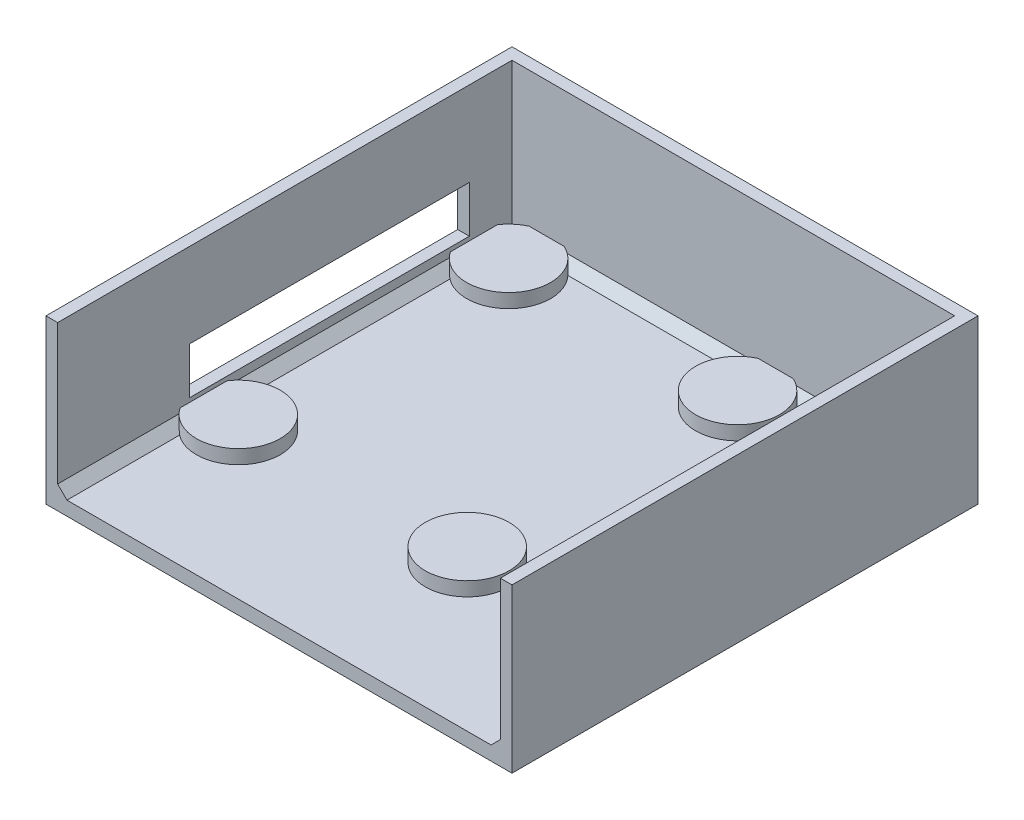
ISO-10303-21;
HEADER;
FILE_DESCRIPTION(('STEP AP214'),'2;1');
FILE_NAME('part.step','',(''),(''),'','','');
FILE_SCHEMA(('AUTOMOTIVE_DESIGN { 1 0 10303 214 1 1 1 1 }'));
ENDSEC;
DATA;
#1=APPLICATION_CONTEXT('core data for automotive mechanical design processes');
#2=APPLICATION_PROTOCOL_DEFINITION('international standard','automotive_design',2000,#1);
#3=PRODUCT_CONTEXT('',#1,'mechanical');
#4=PRODUCT('Part','Part','',(#3));
#5=PRODUCT_RELATED_PRODUCT_CATEGORY('part','',(#4));
#6=PRODUCT_DEFINITION_FORMATION('','',#4);
#7=PRODUCT_DEFINITION_CONTEXT('part definition',#1,'design');
#8=PRODUCT_DEFINITION('design','',#6,#7);
#9=PRODUCT_DEFINITION_SHAPE('','',#8);
#10=(LENGTH_UNIT() NAMED_UNIT(*) SI_UNIT(.MILLI.,.METRE.));
#11=(NAMED_UNIT(*) PLANE_ANGLE_UNIT() SI_UNIT($,.RADIAN.));
#12=(NAMED_UNIT(*) SI_UNIT($,.STERADIAN.) SOLID_ANGLE_UNIT());
#13=UNCERTAINTY_MEASURE_WITH_UNIT(LENGTH_MEASURE(1.E-05),#10,'distance_accuracy_value','');
#14=(GEOMETRIC_REPRESENTATION_CONTEXT(3) GLOBAL_UNCERTAINTY_ASSIGNED_CONTEXT((#13)) GLOBAL_UNIT_ASSIGNED_CONTEXT((#10,
#11,#12)) REPRESENTATION_CONTEXT('',''));
#15=CARTESIAN_POINT('',(0.,0.,0.));
#16=DIRECTION('',(0.,0.,1.));
#17=DIRECTION('',(1.,0.,0.));
#18=AXIS2_PLACEMENT_3D('',#15,#16,#17);
#19=CARTESIAN_POINT('',(-67.4136147725269,35.,-33.8319198921413));
#20=DIRECTION('',(-1.,0.,0.));
#21=DIRECTION('',(0.,0.,1.));
#22=AXIS2_PLACEMENT_3D('',#19,#20,#21);
#23=PLANE('',#22);
#24=DIRECTION('',(0.,0.,1.));
#25=VECTOR('',#24,1.);
#26=CARTESIAN_POINT('',(-67.4136147725269,16.8739403142127,-24.6733703534207));
#27=LINE('',#26,#25);
#28=CARTESIAN_POINT('',(-67.4136147725269,16.8739403142127,-24.6733703534207));
#29=VERTEX_POINT('',#28);
#30=CARTESIAN_POINT('',(-67.4136147725269,16.8739403142127,35.3266296465793));
#31=VERTEX_POINT('',#30);
#32=EDGE_CURVE('E575',#29,#31,#27,.T.);
#33=ORIENTED_EDGE('',*,*,#32,.F.);
#34=DIRECTION('',(0.,1.,0.));
#35=VECTOR('',#34,1.);
#36=CARTESIAN_POINT('',(-67.4136147725269,16.8739403142127,-24.6733703534207));
#37=LINE('',#36,#35);
#38=CARTESIAN_POINT('',(-67.4136147725269,6.87394031421267,-24.6733703534207));
#39=VERTEX_POINT('',#38);
#40=EDGE_CURVE('E252',#39,#29,#37,.T.);
#41=ORIENTED_EDGE('',*,*,#40,.F.);
#42=DIRECTION('',(0.,0.,-1.));
#43=VECTOR('',#42,1.);
#44=CARTESIAN_POINT('',(-67.4136147725269,6.87394031421267,-24.6733703534207));
#45=LINE('',#44,#43);
#46=CARTESIAN_POINT('',(-67.4136147725268,6.87394031421267,35.3266296465794));
#47=VERTEX_POINT('',#46);
#48=EDGE_CURVE('E248',#47,#39,#45,.T.);
#49=ORIENTED_EDGE('',*,*,#48,.F.);
#50=DIRECTION('',(0.,-1.,0.));
#51=VECTOR('',#50,1.);
#52=CARTESIAN_POINT('',(-67.4136147725269,16.8739403142127,35.3266296465793));
#53=LINE('',#52,#51);
#54=EDGE_CURVE('E214',#31,#47,#53,.T.);
#55=ORIENTED_EDGE('',*,*,#54,.F.);
#56=EDGE_LOOP('',(#33,#41,#49,#55));
#57=FACE_BOUND('',#56,.T.);
#58=DIRECTION('',(0.,-1.,0.));
#59=VECTOR('',#58,1.);
#60=CARTESIAN_POINT('',(-67.4136147725268,35.,63.6680801078587));
#61=LINE('',#60,#59);
#62=CARTESIAN_POINT('',(-67.4136147725268,35.,63.6680801078587));
#63=VERTEX_POINT('',#62);
#64=CARTESIAN_POINT('',(-67.4136147725268,5.,63.6680801078587));
#65=VERTEX_POINT('',#64);
#66=EDGE_CURVE('E344',#63,#65,#61,.T.);
#67=ORIENTED_EDGE('',*,*,#66,.T.);
#68=DIRECTION('',(0.,0.,-1.));
#69=VECTOR('',#68,1.);
#70=CARTESIAN_POINT('',(-67.4136147725269,5.,-33.8319198921413));
#71=LINE('',#70,#69);
#72=CARTESIAN_POINT('',(-67.4136147725268,5.,37.3965259119556));
#73=VERTEX_POINT('',#72);
#74=EDGE_CURVE('E416',#65,#73,#71,.T.);
#75=ORIENTED_EDGE('',*,*,#74,.T.);
#76=DIRECTION('',(0.,-1.,0.));
#77=VECTOR('',#76,1.);
#78=CARTESIAN_POINT('',(-67.4136147725268,6.,37.3965259119556));
#79=LINE('',#78,#77);
#80=CARTESIAN_POINT('',(-67.4136147725268,6.,37.3965259119556));
#81=VERTEX_POINT('',#80);
#82=EDGE_CURVE('E264',#81,#73,#79,.T.);
#83=ORIENTED_EDGE('',*,*,#82,.F.);
#84=DIRECTION('',(0.,0.,-1.));
#85=VECTOR('',#84,1.);
#86=CARTESIAN_POINT('',(-67.4136147725269,6.,-33.8319198921413));
#87=LINE('',#86,#85);
#88=CARTESIAN_POINT('',(-67.4136147725268,6.,27.3005324586783));
#89=VERTEX_POINT('',#88);
#90=EDGE_CURVE('E408',#81,#89,#87,.T.);
#91=ORIENTED_EDGE('',*,*,#90,.T.);
#92=DIRECTION('',(0.,-1.,0.));
#93=VECTOR('',#92,1.);
#94=CARTESIAN_POINT('',(-67.4136147725268,6.,27.3005324586783));
#95=LINE('',#94,#93);
#96=CARTESIAN_POINT('',(-67.4136147725268,5.,27.3005324586783));
#97=VERTEX_POINT('',#96);
#98=EDGE_CURVE('E268',#97,#89,#95,.F.);
#99=ORIENTED_EDGE('',*,*,#98,.F.);
#100=DIRECTION('',(0.,0.,-1.));
#101=VECTOR('',#100,1.);
#102=CARTESIAN_POINT('',(-67.4136147725269,5.,-33.8319198921413));
#103=LINE('',#102,#101);
#104=CARTESIAN_POINT('',(-67.4136147725269,5.,-20.609941337993));
#105=VERTEX_POINT('',#104);
#106=EDGE_CURVE('E412',#97,#105,#103,.T.);
#107=ORIENTED_EDGE('',*,*,#106,.T.);
#108=DIRECTION('',(0.,-1.,0.));
#109=VECTOR('',#108,1.);
#110=CARTESIAN_POINT('',(-67.4136147725269,6.,-20.609941337993));
#111=LINE('',#110,#109);
#112=CARTESIAN_POINT('',(-67.4136147725269,6.,-20.609941337993));
#113=VERTEX_POINT('',#112);
#114=EDGE_CURVE('E396',#113,#105,#111,.T.);
#115=ORIENTED_EDGE('',*,*,#114,.F.);
#116=DIRECTION('',(0.,0.,-1.));
#117=VECTOR('',#116,1.);
#118=CARTESIAN_POINT('',(-67.4136147725269,6.,-33.8319198921413));
#119=LINE('',#118,#117);
#120=CARTESIAN_POINT('',(-67.4136147725269,6.,-30.7059347912702));
#121=VERTEX_POINT('',#120);
#122=EDGE_CURVE('E392',#113,#121,#119,.T.);
#123=ORIENTED_EDGE('',*,*,#122,.T.);
#124=DIRECTION('',(0.,-1.,0.));
#125=VECTOR('',#124,1.);
#126=CARTESIAN_POINT('',(-67.4136147725269,6.,-30.7059347912702));
#127=LINE('',#126,#125);
#128=CARTESIAN_POINT('',(-67.4136147725269,3.,-30.7059347912702));
#129=VERTEX_POINT('',#128);
#130=EDGE_CURVE('E400',#129,#121,#127,.F.);
#131=ORIENTED_EDGE('',*,*,#130,.F.);
#132=DIRECTION('',(0.,0.,-1.));
#133=VECTOR('',#132,1.);
#134=CARTESIAN_POINT('',(-67.4136147725269,3.,-33.8319198921413));
#135=LINE('',#134,#133);
#136=CARTESIAN_POINT('',(-67.4136147725269,3.,-33.8319198921413));
#137=VERTEX_POINT('',#136);
#138=EDGE_CURVE('E296',#129,#137,#135,.T.);
#139=ORIENTED_EDGE('',*,*,#138,.T.);
#140=DIRECTION('',(0.,-1.,0.));
#141=VECTOR('',#140,1.);
#142=CARTESIAN_POINT('',(-67.4136147725269,35.,-33.8319198921413));
#143=LINE('',#142,#141);
#144=CARTESIAN_POINT('',(-67.4136147725269,35.,-33.8319198921413));
#145=VERTEX_POINT('',#144);
#146=EDGE_CURVE('E340',#145,#137,#143,.T.);
#147=ORIENTED_EDGE('',*,*,#146,.F.);
#148=DIRECTION('',(0.,0.,-1.));
#149=VECTOR('',#148,1.);
#150=CARTESIAN_POINT('',(-67.4136147725268,35.,61.0418253424466));
#151=LINE('',#150,#149);
#152=EDGE_CURVE('E308',#63,#145,#151,.T.);
#153=ORIENTED_EDGE('',*,*,#152,.F.);
#154=EDGE_LOOP('',(#67,#75,#83,#91,#99,#107,#115,#123,#131,#139,#147,#153));
#155=FACE_BOUND('',#154,.T.);
#156=ADVANCED_FACE('F39',(#57,#155),#23,.F.);
#157=CARTESIAN_POINT('',(-67.4136147725269,35.,-33.8319198921413));
#158=DIRECTION('',(0.,0.,-1.));
#159=DIRECTION('',(-1.,0.,0.));
#160=AXIS2_PLACEMENT_3D('',#157,#158,#159);
#161=PLANE('',#160);
#162=DIRECTION('',(0.,-1.,0.));
#163=VECTOR('',#162,1.);
#164=CARTESIAN_POINT('',(-7.07288139532457,6.,-33.8319198921413));
#165=LINE('',#164,#163);
#166=CARTESIAN_POINT('',(-7.07288139532457,5.,-33.8319198921413));
#167=VERTEX_POINT('',#166);
#168=CARTESIAN_POINT('',(-7.07288139532457,6.,-33.8319198921413));
#169=VERTEX_POINT('',#168);
#170=EDGE_CURVE('E389',#167,#169,#165,.F.);
#171=ORIENTED_EDGE('',*,*,#170,.F.);
#172=DIRECTION('',(1.,0.,0.));
#173=VECTOR('',#172,1.);
#174=CARTESIAN_POINT('',(-67.4136147725269,5.,-33.8319198921413));
#175=LINE('',#174,#173);
#176=CARTESIAN_POINT('',(27.5863852274731,5.,-33.8319198921413));
#177=VERTEX_POINT('',#176);
#178=EDGE_CURVE('E445',#167,#177,#175,.T.);
#179=ORIENTED_EDGE('',*,*,#178,.T.);
#180=DIRECTION('',(0.,-1.,0.));
#181=VECTOR('',#180,1.);
#182=CARTESIAN_POINT('',(27.5863852274731,35.,-33.8319198921413));
#183=LINE('',#182,#181);
#184=CARTESIAN_POINT('',(27.5863852274731,35.,-33.8319198921413));
#185=VERTEX_POINT('',#184);
#186=EDGE_CURVE('E337',#185,#177,#183,.T.);
#187=ORIENTED_EDGE('',*,*,#186,.F.);
#188=DIRECTION('',(1.,0.,0.));
#189=VECTOR('',#188,1.);
#190=CARTESIAN_POINT('',(-67.4136147725269,35.,-33.8319198921413));
#191=LINE('',#190,#189);
#192=EDGE_CURVE('E311',#145,#185,#191,.T.);
#193=ORIENTED_EDGE('',*,*,#192,.F.);
#194=ORIENTED_EDGE('',*,*,#146,.T.);
#195=DIRECTION('',(1.,0.,0.));
#196=VECTOR('',#195,1.);
#197=CARTESIAN_POINT('',(-67.4136147725269,3.,-33.8319198921413));
#198=LINE('',#197,#196);
#199=CARTESIAN_POINT('',(-63.7290262288278,3.,-33.8319198921413));
#200=VERTEX_POINT('',#199);
#201=EDGE_CURVE('E305',#137,#200,#198,.T.);
#202=ORIENTED_EDGE('',*,*,#201,.T.);
#203=DIRECTION('',(0.,-1.,0.));
#204=VECTOR('',#203,1.);
#205=CARTESIAN_POINT('',(-63.7290262288278,6.,-33.8319198921413));
#206=LINE('',#205,#204);
#207=CARTESIAN_POINT('',(-63.7290262288278,6.,-33.8319198921413));
#208=VERTEX_POINT('',#207);
#209=EDGE_CURVE('E285',#208,#200,#206,.T.);
#210=ORIENTED_EDGE('',*,*,#209,.F.);
#211=DIRECTION('',(1.,0.,0.));
#212=VECTOR('',#211,1.);
#213=CARTESIAN_POINT('',(-67.4136147725269,6.,-33.8319198921413));
#214=LINE('',#213,#212);
#215=CARTESIAN_POINT('',(-56.1961592889328,6.,-33.8319198921413));
#216=VERTEX_POINT('',#215);
#217=EDGE_CURVE('E281',#208,#216,#214,.T.);
#218=ORIENTED_EDGE('',*,*,#217,.T.);
#219=DIRECTION('',(0.,-1.,0.));
#220=VECTOR('',#219,1.);
#221=CARTESIAN_POINT('',(-56.1961592889328,6.,-33.8319198921413));
#222=LINE('',#221,#220);
#223=CARTESIAN_POINT('',(-56.1961592889328,5.,-33.8319198921413));
#224=VERTEX_POINT('',#223);
#225=EDGE_CURVE('E288',#224,#216,#222,.F.);
#226=ORIENTED_EDGE('',*,*,#225,.F.);
#227=DIRECTION('',(1.,0.,0.));
#228=VECTOR('',#227,1.);
#229=CARTESIAN_POINT('',(-67.4136147725269,5.,-33.8319198921413));
#230=LINE('',#229,#228);
#231=CARTESIAN_POINT('',(-14.6057483352195,5.,-33.8319198921413));
#232=VERTEX_POINT('',#231);
#233=EDGE_CURVE('E441',#224,#232,#230,.T.);
#234=ORIENTED_EDGE('',*,*,#233,.T.);
#235=DIRECTION('',(0.,-1.,0.));
#236=VECTOR('',#235,1.);
#237=CARTESIAN_POINT('',(-14.6057483352195,6.,-33.8319198921413));
#238=LINE('',#237,#236);
#239=CARTESIAN_POINT('',(-14.6057483352195,6.,-33.8319198921413));
#240=VERTEX_POINT('',#239);
#241=EDGE_CURVE('E385',#240,#232,#238,.T.);
#242=ORIENTED_EDGE('',*,*,#241,.F.);
#243=DIRECTION('',(1.,0.,0.));
#244=VECTOR('',#243,1.);
#245=CARTESIAN_POINT('',(-67.4136147725269,6.,-33.8319198921413));
#246=LINE('',#245,#244);
#247=EDGE_CURVE('E381',#240,#169,#246,.T.);
#248=ORIENTED_EDGE('',*,*,#247,.T.);
#249=EDGE_LOOP('',(#171,#179,#187,#193,#194,#202,#210,#218,#226,#234,#242,#248));
#250=FACE_BOUND('',#249,.T.);
#251=ADVANCED_FACE('F509',(#250),#161,.F.);
#252=CARTESIAN_POINT('',(0.,3.,0.));
#253=DIRECTION('',(0.,1.,0.));
#254=DIRECTION('',(0.,0.,1.));
#255=AXIS2_PLACEMENT_3D('',#252,#253,#254);
#256=PLANE('',#255);
#257=ORIENTED_EDGE('',*,*,#138,.F.);
#258=CARTESIAN_POINT('',(-59.9625927588803,3.,-25.6579380646316));
#259=DIRECTION('',(0.,1.,0.));
#260=DIRECTION('',(0.,0.,1.));
#261=AXIS2_PLACEMENT_3D('',#258,#259,#260);
#262=CIRCLE('',#261,9.);
#263=EDGE_CURVE('E277',#200,#129,#262,.T.);
#264=ORIENTED_EDGE('',*,*,#263,.F.);
#265=ORIENTED_EDGE('',*,*,#201,.F.);
#266=EDGE_LOOP('',(#257,#264,#265));
#267=FACE_BOUND('',#266,.T.);
#268=ADVANCED_FACE('F516',(#267),#256,.T.);
#269=CARTESIAN_POINT('',(-69.9136147725269,3.,-36.3319198921413));
#270=DIRECTION('',(1.,0.,0.));
#271=DIRECTION('',(0.,0.,-1.));
#272=AXIS2_PLACEMENT_3D('',#269,#270,#271);
#273=PLANE('',#272);
#274=DIRECTION('',(0.,0.,1.));
#275=VECTOR('',#274,1.);
#276=CARTESIAN_POINT('',(-69.9136147725268,6.87394031421267,-24.6733703534207));
#277=LINE('',#276,#275);
#278=CARTESIAN_POINT('',(-69.9136147725269,6.87394031421267,-24.6733703534207));
#279=VERTEX_POINT('',#278);
#280=CARTESIAN_POINT('',(-69.9136147725268,6.87394031421267,35.3266296465793));
#281=VERTEX_POINT('',#280);
#282=EDGE_CURVE('E223',#279,#281,#277,.T.);
#283=ORIENTED_EDGE('',*,*,#282,.F.);
#284=DIRECTION('',(0.,-1.,0.));
#285=VECTOR('',#284,1.);
#286=CARTESIAN_POINT('',(-69.9136147725268,16.8739403142127,-24.6733703534207));
#287=LINE('',#286,#285);
#288=CARTESIAN_POINT('',(-69.9136147725268,16.8739403142127,-24.6733703534207));
#289=VERTEX_POINT('',#288);
#290=EDGE_CURVE('E229',#289,#279,#287,.T.);
#291=ORIENTED_EDGE('',*,*,#290,.F.);
#292=DIRECTION('',(0.,0.,-1.));
#293=VECTOR('',#292,1.);
#294=CARTESIAN_POINT('',(-69.9136147725268,16.8739403142127,-24.6733703534207));
#295=LINE('',#294,#293);
#296=CARTESIAN_POINT('',(-69.9136147725268,16.8739403142127,35.3266296465793));
#297=VERTEX_POINT('',#296);
#298=EDGE_CURVE('E234',#297,#289,#295,.T.);
#299=ORIENTED_EDGE('',*,*,#298,.F.);
#300=DIRECTION('',(0.,1.,0.));
#301=VECTOR('',#300,1.);
#302=CARTESIAN_POINT('',(-69.9136147725268,16.8739403142127,35.3266296465793));
#303=LINE('',#302,#301);
#304=EDGE_CURVE('E211',#281,#297,#303,.T.);
#305=ORIENTED_EDGE('',*,*,#304,.F.);
#306=EDGE_LOOP('',(#283,#291,#299,#305));
#307=FACE_BOUND('',#306,.T.);
#308=DIRECTION('',(0.,0.,1.));
#309=VECTOR('',#308,1.);
#310=CARTESIAN_POINT('',(-69.9136147725269,0.,-36.3319198921413));
#311=LINE('',#310,#309);
#312=CARTESIAN_POINT('',(-69.9136147725269,0.,-36.3319198921413));
#313=VERTEX_POINT('',#312);
#314=CARTESIAN_POINT('',(-69.9136147725268,0.,63.6680801078587));
#315=VERTEX_POINT('',#314);
#316=EDGE_CURVE('E348',#313,#315,#311,.T.);
#317=ORIENTED_EDGE('',*,*,#316,.T.);
#318=DIRECTION('',(0.,-1.,0.));
#319=VECTOR('',#318,1.);
#320=CARTESIAN_POINT('',(-69.9136147725268,3.,63.6680801078587));
#321=LINE('',#320,#319);
#322=CARTESIAN_POINT('',(-69.9136147725269,35.,63.6680801078587));
#323=VERTEX_POINT('',#322);
#324=EDGE_CURVE('E377',#323,#315,#321,.T.);
#325=ORIENTED_EDGE('',*,*,#324,.F.);
#326=DIRECTION('',(0.,0.,1.));
#327=VECTOR('',#326,1.);
#328=CARTESIAN_POINT('',(-69.9136147725269,35.,-36.3319198921413));
#329=LINE('',#328,#327);
#330=CARTESIAN_POINT('',(-69.9136147725269,35.,-36.3319198921413));
#331=VERTEX_POINT('',#330);
#332=EDGE_CURVE('E300',#331,#323,#329,.T.);
#333=ORIENTED_EDGE('',*,*,#332,.F.);
#334=DIRECTION('',(0.,-1.,0.));
#335=VECTOR('',#334,1.);
#336=CARTESIAN_POINT('',(-69.9136147725269,3.,-36.3319198921413));
#337=LINE('',#336,#335);
#338=EDGE_CURVE('E353',#331,#313,#337,.T.);
#339=ORIENTED_EDGE('',*,*,#338,.T.);
#340=EDGE_LOOP('',(#317,#325,#333,#339));
#341=FACE_BOUND('',#340,.T.);
#342=ADVANCED_FACE('F231',(#307,#341),#273,.F.);
#343=CARTESIAN_POINT('',(-69.9136147725268,3.,63.6680801078587));
#344=DIRECTION('',(0.,0.,-1.));
#345=DIRECTION('',(-1.,0.,0.));
#346=AXIS2_PLACEMENT_3D('',#343,#344,#345);
#347=PLANE('',#346);
#348=DIRECTION('',(1.,0.,0.));
#349=VECTOR('',#348,1.);
#350=CARTESIAN_POINT('',(-69.9136147725268,0.,63.6680801078587));
#351=LINE('',#350,#349);
#352=CARTESIAN_POINT('',(30.0863852274732,0.,63.6680801078587));
#353=VERTEX_POINT('',#352);
#354=EDGE_CURVE('E358',#315,#353,#351,.T.);
#355=ORIENTED_EDGE('',*,*,#354,.T.);
#356=DIRECTION('',(0.,-1.,0.));
#357=VECTOR('',#356,1.);
#358=CARTESIAN_POINT('',(30.0863852274732,3.,63.6680801078587));
#359=LINE('',#358,#357);
#360=CARTESIAN_POINT('',(30.0863852274732,35.,63.6680801078587));
#361=VERTEX_POINT('',#360);
#362=EDGE_CURVE('E373',#361,#353,#359,.T.);
#363=ORIENTED_EDGE('',*,*,#362,.F.);
#364=DIRECTION('',(1.,0.,0.));
#365=VECTOR('',#364,1.);
#366=CARTESIAN_POINT('',(27.5863852274732,35.,63.6680801078587));
#367=LINE('',#366,#365);
#368=CARTESIAN_POINT('',(27.5863852274732,35.,63.6680801078587));
#369=VERTEX_POINT('',#368);
#370=EDGE_CURVE('E317',#369,#361,#367,.T.);
#371=ORIENTED_EDGE('',*,*,#370,.F.);
#372=DIRECTION('',(0.,-1.,0.));
#373=VECTOR('',#372,1.);
#374=CARTESIAN_POINT('',(27.5863852274732,35.,63.6680801078587));
#375=LINE('',#374,#373);
#376=CARTESIAN_POINT('',(27.5863852274732,5.,63.6680801078587));
#377=VERTEX_POINT('',#376);
#378=EDGE_CURVE('E329',#369,#377,#375,.T.);
#379=ORIENTED_EDGE('',*,*,#378,.T.);
#380=DIRECTION('',(-0.707106781186545,-0.70710678118655,0.));
#381=VECTOR('',#380,1.);
#382=CARTESIAN_POINT('',(-22.1636147725265,-44.75,63.6680801078587));
#383=LINE('',#382,#381);
#384=CARTESIAN_POINT('',(25.5863852274731,3.,63.6680801078587));
#385=VERTEX_POINT('',#384);
#386=EDGE_CURVE('E11',#377,#385,#383,.T.);
#387=ORIENTED_EDGE('',*,*,#386,.T.);
#388=DIRECTION('',(1.,0.,0.));
#389=VECTOR('',#388,1.);
#390=CARTESIAN_POINT('',(-69.9136147725268,3.,63.6680801078587));
#391=LINE('',#390,#389);
#392=CARTESIAN_POINT('',(-65.4136147725269,3.,63.6680801078587));
#393=VERTEX_POINT('',#392);
#394=EDGE_CURVE('E349',#393,#385,#391,.T.);
#395=ORIENTED_EDGE('',*,*,#394,.F.);
#396=DIRECTION('',(-0.707106781186544,0.707106781186551,0.));
#397=VECTOR('',#396,1.);
#398=CARTESIAN_POINT('',(-67.6636147725268,5.24999999999999,63.6680801078587));
#399=LINE('',#398,#397);
#400=EDGE_CURVE('E49',#393,#65,#399,.T.);
#401=ORIENTED_EDGE('',*,*,#400,.T.);
#402=ORIENTED_EDGE('',*,*,#66,.F.);
#403=DIRECTION('',(1.,0.,0.));
#404=VECTOR('',#403,1.);
#405=CARTESIAN_POINT('',(-69.9136147725269,35.,63.6680801078587));
#406=LINE('',#405,#404);
#407=EDGE_CURVE('E304',#323,#63,#406,.T.);
#408=ORIENTED_EDGE('',*,*,#407,.F.);
#409=ORIENTED_EDGE('',*,*,#324,.T.);
#410=EDGE_LOOP('',(#355,#363,#371,#379,#387,#395,#401,#402,#408,#409));
#411=FACE_BOUND('',#410,.T.);
#412=ADVANCED_FACE('F468',(#411),#347,.F.);
#413=CARTESIAN_POINT('',(30.0863852274731,3.,-36.3319198921413));
#414=DIRECTION('',(-1.,0.,0.));
#415=DIRECTION('',(0.,0.,1.));
#416=AXIS2_PLACEMENT_3D('',#413,#414,#415);
#417=PLANE('',#416);
#418=DIRECTION('',(0.,0.,-1.));
#419=VECTOR('',#418,1.);
#420=CARTESIAN_POINT('',(30.0863852274731,0.,-36.3319198921413));
#421=LINE('',#420,#419);
#422=CARTESIAN_POINT('',(30.0863852274731,0.,-36.3319198921413));
#423=VERTEX_POINT('',#422);
#424=EDGE_CURVE('E361',#353,#423,#421,.T.);
#425=ORIENTED_EDGE('',*,*,#424,.T.);
#426=DIRECTION('',(0.,-1.,0.));
#427=VECTOR('',#426,1.);
#428=CARTESIAN_POINT('',(30.0863852274731,3.,-36.3319198921413));
#429=LINE('',#428,#427);
#430=CARTESIAN_POINT('',(30.0863852274732,35.,-36.3319198921413));
#431=VERTEX_POINT('',#430);
#432=EDGE_CURVE('E369',#431,#423,#429,.T.);
#433=ORIENTED_EDGE('',*,*,#432,.F.);
#434=DIRECTION('',(0.,0.,-1.));
#435=VECTOR('',#434,1.);
#436=CARTESIAN_POINT('',(30.0863852274732,35.,-36.3319198921413));
#437=LINE('',#436,#435);
#438=EDGE_CURVE('E321',#361,#431,#437,.T.);
#439=ORIENTED_EDGE('',*,*,#438,.F.);
#440=ORIENTED_EDGE('',*,*,#362,.T.);
#441=EDGE_LOOP('',(#425,#433,#439,#440));
#442=FACE_BOUND('',#441,.T.);
#443=ADVANCED_FACE('F533',(#442),#417,.F.);
#444=CARTESIAN_POINT('',(-69.9136147725269,3.,-36.3319198921413));
#445=DIRECTION('',(0.,0.,1.));
#446=DIRECTION('',(1.,0.,0.));
#447=AXIS2_PLACEMENT_3D('',#444,#445,#446);
#448=PLANE('',#447);
#449=DIRECTION('',(-1.,0.,0.));
#450=VECTOR('',#449,1.);
#451=CARTESIAN_POINT('',(-69.9136147725269,0.,-36.3319198921413));
#452=LINE('',#451,#450);
#453=EDGE_CURVE('E354',#423,#313,#452,.T.);
#454=ORIENTED_EDGE('',*,*,#453,.T.);
#455=ORIENTED_EDGE('',*,*,#338,.F.);
#456=DIRECTION('',(-1.,0.,0.));
#457=VECTOR('',#456,1.);
#458=CARTESIAN_POINT('',(-69.9136147725269,35.,-36.3319198921413));
#459=LINE('',#458,#457);
#460=EDGE_CURVE('E325',#431,#331,#459,.T.);
#461=ORIENTED_EDGE('',*,*,#460,.F.);
#462=ORIENTED_EDGE('',*,*,#432,.T.);
#463=EDGE_LOOP('',(#454,#455,#461,#462));
#464=FACE_BOUND('',#463,.T.);
#465=ADVANCED_FACE('F525',(#464),#448,.F.);
#466=CARTESIAN_POINT('',(-10.8393148652721,3.,32.3485291853169));
#467=DIRECTION('',(0.,1.,0.));
#468=DIRECTION('',(0.,0.,1.));
#469=AXIS2_PLACEMENT_3D('',#466,#467,#468);
#470=CIRCLE('',#469,9.);
#471=CARTESIAN_POINT('',(-10.8393148652721,3.,41.3485291853169));
#472=VERTEX_POINT('',#471);
#473=EDGE_CURVE('E251',#472,#472,#470,.T.);
#474=ORIENTED_EDGE('',*,*,#473,.F.);
#475=EDGE_LOOP('',(#474));
#476=FACE_BOUND('',#475,.T.);
#477=CARTESIAN_POINT('',(-59.9625927588803,3.,32.3485291853169));
#478=DIRECTION('',(0.,1.,0.));
#479=DIRECTION('',(0.,0.,1.));
#480=AXIS2_PLACEMENT_3D('',#477,#478,#479);
#481=CIRCLE('',#480,9.);
#482=CARTESIAN_POINT('',(-65.4136147725269,3.,25.1870796807306));
#483=VERTEX_POINT('',#482);
#484=CARTESIAN_POINT('',(-65.4136147725269,3.,39.5099786899033));
#485=VERTEX_POINT('',#484);
#486=EDGE_CURVE('E404',#483,#485,#481,.F.);
#487=ORIENTED_EDGE('',*,*,#486,.T.);
#488=DIRECTION('',(0.,0.,1.));
#489=VECTOR('',#488,1.);
#490=CARTESIAN_POINT('',(-65.4136147725269,3.,0.));
#491=LINE('',#490,#489);
#492=EDGE_CURVE('E438',#485,#393,#491,.T.);
#493=ORIENTED_EDGE('',*,*,#492,.T.);
#494=ORIENTED_EDGE('',*,*,#394,.T.);
#495=DIRECTION('',(0.,0.,-1.));
#496=VECTOR('',#495,1.);
#497=CARTESIAN_POINT('',(25.5863852274732,3.,0.));
#498=LINE('',#497,#496);
#499=CARTESIAN_POINT('',(25.5863852274732,3.,-31.8319198921413));
#500=VERTEX_POINT('',#499);
#501=EDGE_CURVE('E432',#385,#500,#498,.T.);
#502=ORIENTED_EDGE('',*,*,#501,.T.);
#503=DIRECTION('',(-1.,0.,0.));
#504=VECTOR('',#503,1.);
#505=CARTESIAN_POINT('',(0.,3.,-31.8319198921413));
#506=LINE('',#505,#504);
#507=CARTESIAN_POINT('',(-4.29088387811342,3.,-31.8319198921413));
#508=VERTEX_POINT('',#507);
#509=EDGE_CURVE('E435',#500,#508,#506,.T.);
#510=ORIENTED_EDGE('',*,*,#509,.T.);
#511=CARTESIAN_POINT('',(-10.8393148652721,3.,-25.6579380646316));
#512=DIRECTION('',(0.,1.,0.));
#513=DIRECTION('',(0.,0.,1.));
#514=AXIS2_PLACEMENT_3D('',#511,#512,#513);
#515=CIRCLE('',#514,9.);
#516=CARTESIAN_POINT('',(-17.3877458524307,3.,-31.8319198921413));
#517=VERTEX_POINT('',#516);
#518=EDGE_CURVE('E291',#517,#508,#515,.T.);
#519=ORIENTED_EDGE('',*,*,#518,.F.);
#520=DIRECTION('',(-1.,0.,0.));
#521=VECTOR('',#520,1.);
#522=CARTESIAN_POINT('',(0.,3.,-31.8319198921413));
#523=LINE('',#522,#521);
#524=CARTESIAN_POINT('',(-53.4141617717216,3.,-31.8319198921413));
#525=VERTEX_POINT('',#524);
#526=EDGE_CURVE('E426',#517,#525,#523,.T.);
#527=ORIENTED_EDGE('',*,*,#526,.T.);
#528=CARTESIAN_POINT('',(-65.4136147725269,3.,-18.4964885600452));
#529=VERTEX_POINT('',#528);
#530=EDGE_CURVE('E271',#529,#525,#262,.T.);
#531=ORIENTED_EDGE('',*,*,#530,.F.);
#532=DIRECTION('',(0.,0.,1.));
#533=VECTOR('',#532,1.);
#534=CARTESIAN_POINT('',(-65.4136147725269,3.,0.));
#535=LINE('',#534,#533);
#536=EDGE_CURVE('E429',#529,#483,#535,.T.);
#537=ORIENTED_EDGE('',*,*,#536,.T.);
#538=EDGE_LOOP('',(#487,#493,#494,#502,#510,#519,#527,#531,#537));
#539=FACE_BOUND('',#538,.T.);
#540=ADVANCED_FACE('F484',(#476,#539),#256,.T.);
#541=CARTESIAN_POINT('',(0.,0.,0.));
#542=DIRECTION('',(0.,1.,0.));
#543=DIRECTION('',(0.,0.,1.));
#544=AXIS2_PLACEMENT_3D('',#541,#542,#543);
#545=PLANE('',#544);
#546=ORIENTED_EDGE('',*,*,#316,.F.);
#547=ORIENTED_EDGE('',*,*,#453,.F.);
#548=ORIENTED_EDGE('',*,*,#424,.F.);
#549=ORIENTED_EDGE('',*,*,#354,.F.);
#550=EDGE_LOOP('',(#546,#547,#548,#549));
#551=FACE_BOUND('',#550,.T.);
#552=ADVANCED_FACE('F524',(#551),#545,.F.);
#553=CARTESIAN_POINT('',(27.5863852274732,35.,61.0418253424466));
#554=DIRECTION('',(1.,0.,0.));
#555=DIRECTION('',(0.,0.,-1.));
#556=AXIS2_PLACEMENT_3D('',#553,#554,#555);
#557=PLANE('',#556);
#558=ORIENTED_EDGE('',*,*,#186,.T.);
#559=DIRECTION('',(0.,0.,1.));
#560=VECTOR('',#559,1.);
#561=CARTESIAN_POINT('',(27.5863852274732,5.,61.0418253424466));
#562=LINE('',#561,#560);
#563=EDGE_CURVE('E56',#177,#377,#562,.T.);
#564=ORIENTED_EDGE('',*,*,#563,.T.);
#565=ORIENTED_EDGE('',*,*,#378,.F.);
#566=DIRECTION('',(0.,0.,1.));
#567=VECTOR('',#566,1.);
#568=CARTESIAN_POINT('',(27.5863852274731,35.,-33.8319198921413));
#569=LINE('',#568,#567);
#570=EDGE_CURVE('E314',#185,#369,#569,.T.);
#571=ORIENTED_EDGE('',*,*,#570,.F.);
#572=EDGE_LOOP('',(#558,#564,#565,#571));
#573=FACE_BOUND('',#572,.T.);
#574=ADVANCED_FACE('F529',(#573),#557,.F.);
#575=CARTESIAN_POINT('',(0.,35.,0.));
#576=DIRECTION('',(0.,1.,0.));
#577=DIRECTION('',(0.,0.,1.));
#578=AXIS2_PLACEMENT_3D('',#575,#576,#577);
#579=PLANE('',#578);
#580=ORIENTED_EDGE('',*,*,#332,.T.);
#581=ORIENTED_EDGE('',*,*,#407,.T.);
#582=ORIENTED_EDGE('',*,*,#152,.T.);
#583=ORIENTED_EDGE('',*,*,#192,.T.);
#584=ORIENTED_EDGE('',*,*,#570,.T.);
#585=ORIENTED_EDGE('',*,*,#370,.T.);
#586=ORIENTED_EDGE('',*,*,#438,.T.);
#587=ORIENTED_EDGE('',*,*,#460,.T.);
#588=EDGE_LOOP('',(#580,#581,#582,#583,#584,#585,#586,#587));
#589=FACE_BOUND('',#588,.T.);
#590=ADVANCED_FACE('F681',(#589),#579,.T.);
#591=CARTESIAN_POINT('',(-10.8393148652721,6.,-25.6579380646316));
#592=DIRECTION('',(0.,-1.,0.));
#593=DIRECTION('',(0.,0.,-1.));
#594=AXIS2_PLACEMENT_3D('',#591,#592,#593);
#595=CYLINDRICAL_SURFACE('',#594,9.);
#596=ORIENTED_EDGE('',*,*,#518,.T.);
#597=CARTESIAN_POINT('',(-10.8393148652721,-3.17398182750979,-25.6579380646316));
#598=DIRECTION('',(0.,-0.707106781186545,-0.70710678118655));
#599=DIRECTION('',(0.,-0.70710678118655,0.707106781186545));
#600=AXIS2_PLACEMENT_3D('',#597,#598,#599);
#601=ELLIPSE('',#600,12.7279220613579,9.);
#602=EDGE_CURVE('E452',#508,#167,#601,.F.);
#603=ORIENTED_EDGE('',*,*,#602,.T.);
#604=ORIENTED_EDGE('',*,*,#170,.T.);
#605=CARTESIAN_POINT('',(-10.8393148652721,6.,-25.6579380646316));
#606=DIRECTION('',(0.,1.,0.));
#607=DIRECTION('',(0.,0.,1.));
#608=AXIS2_PLACEMENT_3D('',#605,#606,#607);
#609=CIRCLE('',#608,9.);
#610=EDGE_CURVE('E292',#240,#169,#609,.T.);
#611=ORIENTED_EDGE('',*,*,#610,.F.);
#612=ORIENTED_EDGE('',*,*,#241,.T.);
#613=CARTESIAN_POINT('',(-10.8393148652721,-3.17398182750979,-25.6579380646316));
#614=DIRECTION('',(0.,-0.707106781186545,-0.70710678118655));
#615=DIRECTION('',(0.,-0.70710678118655,0.707106781186545));
#616=AXIS2_PLACEMENT_3D('',#613,#614,#615);
#617=ELLIPSE('',#616,12.7279220613579,9.);
#618=EDGE_CURVE('E449',#232,#517,#617,.F.);
#619=ORIENTED_EDGE('',*,*,#618,.T.);
#620=EDGE_LOOP('',(#596,#603,#604,#611,#612,#619));
#621=FACE_BOUND('',#620,.T.);
#622=ADVANCED_FACE('F677',(#621),#595,.T.);
#623=CARTESIAN_POINT('',(-10.8393148652721,6.,-25.6579380646316));
#624=DIRECTION('',(0.,1.,0.));
#625=DIRECTION('',(0.,0.,1.));
#626=AXIS2_PLACEMENT_3D('',#623,#624,#625);
#627=PLANE('',#626);
#628=ORIENTED_EDGE('',*,*,#247,.F.);
#629=ORIENTED_EDGE('',*,*,#610,.T.);
#630=EDGE_LOOP('',(#628,#629));
#631=FACE_BOUND('',#630,.T.);
#632=ADVANCED_FACE('F671',(#631),#627,.T.);
#633=CARTESIAN_POINT('',(-59.9625927588803,6.,-25.6579380646316));
#634=DIRECTION('',(0.,-1.,0.));
#635=DIRECTION('',(0.,0.,-1.));
#636=AXIS2_PLACEMENT_3D('',#633,#634,#635);
#637=CYLINDRICAL_SURFACE('',#636,9.);
#638=ORIENTED_EDGE('',*,*,#114,.T.);
#639=CARTESIAN_POINT('',(-59.9625927588803,-2.45102201364663,-25.6579380646316));
#640=DIRECTION('',(-0.707106781186551,-0.707106781186544,0.));
#641=DIRECTION('',(0.707106781186544,-0.707106781186551,0.));
#642=AXIS2_PLACEMENT_3D('',#639,#640,#641);
#643=ELLIPSE('',#642,12.7279220613579,9.);
#644=EDGE_CURVE('E460',#105,#529,#643,.F.);
#645=ORIENTED_EDGE('',*,*,#644,.T.);
#646=ORIENTED_EDGE('',*,*,#530,.T.);
#647=CARTESIAN_POINT('',(-59.9625927588803,-3.17398182750979,-25.6579380646316));
#648=DIRECTION('',(0.,-0.707106781186545,-0.70710678118655));
#649=DIRECTION('',(0.,-0.70710678118655,0.707106781186545));
#650=AXIS2_PLACEMENT_3D('',#647,#648,#649);
#651=ELLIPSE('',#650,12.7279220613579,9.);
#652=EDGE_CURVE('E457',#525,#224,#651,.F.);
#653=ORIENTED_EDGE('',*,*,#652,.T.);
#654=ORIENTED_EDGE('',*,*,#225,.T.);
#655=CARTESIAN_POINT('',(-59.9625927588803,6.,-25.6579380646316));
#656=DIRECTION('',(0.,1.,0.));
#657=DIRECTION('',(0.,0.,1.));
#658=AXIS2_PLACEMENT_3D('',#655,#656,#657);
#659=CIRCLE('',#658,9.);
#660=EDGE_CURVE('E272',#113,#216,#659,.T.);
#661=ORIENTED_EDGE('',*,*,#660,.F.);
#662=EDGE_LOOP('',(#638,#645,#646,#653,#654,#661));
#663=FACE_BOUND('',#662,.T.);
#664=ADVANCED_FACE('F562',(#663),#637,.T.);
#665=EDGE_CURVE('E276',#208,#121,#659,.T.);
#666=ORIENTED_EDGE('',*,*,#665,.F.);
#667=ORIENTED_EDGE('',*,*,#209,.T.);
#668=ORIENTED_EDGE('',*,*,#263,.T.);
#669=ORIENTED_EDGE('',*,*,#130,.T.);
#670=EDGE_LOOP('',(#666,#667,#668,#669));
#671=FACE_BOUND('',#670,.T.);
#672=ADVANCED_FACE('F504',(#671),#637,.T.);
#673=CARTESIAN_POINT('',(-59.9625927588803,6.,-25.6579380646316));
#674=DIRECTION('',(0.,1.,0.));
#675=DIRECTION('',(0.,0.,1.));
#676=AXIS2_PLACEMENT_3D('',#673,#674,#675);
#677=PLANE('',#676);
#678=ORIENTED_EDGE('',*,*,#217,.F.);
#679=ORIENTED_EDGE('',*,*,#665,.T.);
#680=ORIENTED_EDGE('',*,*,#122,.F.);
#681=ORIENTED_EDGE('',*,*,#660,.T.);
#682=EDGE_LOOP('',(#678,#679,#680,#681));
#683=FACE_BOUND('',#682,.T.);
#684=ADVANCED_FACE('F495',(#683),#677,.T.);
#685=CARTESIAN_POINT('',(-59.9625927588803,6.,32.3485291853169));
#686=DIRECTION('',(0.,1.,0.));
#687=DIRECTION('',(0.,0.,1.));
#688=AXIS2_PLACEMENT_3D('',#685,#686,#687);
#689=PLANE('',#688);
#690=ORIENTED_EDGE('',*,*,#90,.F.);
#691=CARTESIAN_POINT('',(-59.9625927588803,6.,32.3485291853169));
#692=DIRECTION('',(0.,1.,0.));
#693=DIRECTION('',(0.,0.,1.));
#694=AXIS2_PLACEMENT_3D('',#691,#692,#693);
#695=CIRCLE('',#694,9.);
#696=EDGE_CURVE('E257',#81,#89,#695,.T.);
#697=ORIENTED_EDGE('',*,*,#696,.T.);
#698=EDGE_LOOP('',(#690,#697));
#699=FACE_BOUND('',#698,.T.);
#700=ADVANCED_FACE('F493',(#699),#689,.T.);
#701=CARTESIAN_POINT('',(-59.9625927588803,6.,32.3485291853169));
#702=DIRECTION('',(0.,-1.,0.));
#703=DIRECTION('',(0.,0.,-1.));
#704=AXIS2_PLACEMENT_3D('',#701,#702,#703);
#705=CYLINDRICAL_SURFACE('',#704,9.);
#706=ORIENTED_EDGE('',*,*,#82,.T.);
#707=CARTESIAN_POINT('',(-59.9625927588803,-2.45102201364663,32.3485291853169));
#708=DIRECTION('',(-0.707106781186551,-0.707106781186544,0.));
#709=DIRECTION('',(0.707106781186544,-0.707106781186551,0.));
#710=AXIS2_PLACEMENT_3D('',#707,#708,#709);
#711=ELLIPSE('',#710,12.7279220613579,9.);
#712=EDGE_CURVE('E423',#73,#485,#711,.F.);
#713=ORIENTED_EDGE('',*,*,#712,.T.);
#714=ORIENTED_EDGE('',*,*,#486,.F.);
#715=CARTESIAN_POINT('',(-59.9625927588803,-2.45102201364663,32.3485291853169));
#716=DIRECTION('',(-0.707106781186551,-0.707106781186544,0.));
#717=DIRECTION('',(0.707106781186544,-0.707106781186551,0.));
#718=AXIS2_PLACEMENT_3D('',#715,#716,#717);
#719=ELLIPSE('',#718,12.7279220613579,9.);
#720=EDGE_CURVE('E420',#483,#97,#719,.F.);
#721=ORIENTED_EDGE('',*,*,#720,.T.);
#722=ORIENTED_EDGE('',*,*,#98,.T.);
#723=ORIENTED_EDGE('',*,*,#696,.F.);
#724=EDGE_LOOP('',(#706,#713,#714,#721,#722,#723));
#725=FACE_BOUND('',#724,.T.);
#726=ADVANCED_FACE('F480',(#725),#705,.T.);
#727=CARTESIAN_POINT('',(-10.8393148652721,6.,32.3485291853169));
#728=DIRECTION('',(0.,-1.,0.));
#729=DIRECTION('',(0.,0.,-1.));
#730=AXIS2_PLACEMENT_3D('',#727,#728,#729);
#731=CYLINDRICAL_SURFACE('',#730,9.);
#732=CARTESIAN_POINT('',(-10.8393148652721,6.,32.3485291853169));
#733=DIRECTION('',(0.,1.,0.));
#734=DIRECTION('',(0.,0.,1.));
#735=AXIS2_PLACEMENT_3D('',#732,#733,#734);
#736=CIRCLE('',#735,9.);
#737=CARTESIAN_POINT('',(-10.8393148652721,6.,41.3485291853169));
#738=VERTEX_POINT('',#737);
#739=EDGE_CURVE('E253',#738,#738,#736,.T.);
#740=ORIENTED_EDGE('',*,*,#739,.F.);
#741=EDGE_LOOP('',(#740));
#742=FACE_BOUND('',#741,.T.);
#743=ORIENTED_EDGE('',*,*,#473,.T.);
#744=EDGE_LOOP('',(#743));
#745=FACE_BOUND('',#744,.T.);
#746=ADVANCED_FACE('F502',(#742,#745),#731,.T.);
#747=CARTESIAN_POINT('',(-10.8393148652721,6.,32.3485291853169));
#748=DIRECTION('',(0.,1.,0.));
#749=DIRECTION('',(0.,0.,1.));
#750=AXIS2_PLACEMENT_3D('',#747,#748,#749);
#751=PLANE('',#750);
#752=ORIENTED_EDGE('',*,*,#739,.T.);
#753=EDGE_LOOP('',(#752));
#754=FACE_BOUND('',#753,.T.);
#755=ADVANCED_FACE('F595',(#754),#751,.T.);
#756=CARTESIAN_POINT('',(-6.58598946954468,16.8739403142127,-24.6733703534207));
#757=DIRECTION('',(0.,0.,-1.));
#758=DIRECTION('',(-1.,0.,0.));
#759=AXIS2_PLACEMENT_3D('',#756,#757,#758);
#760=PLANE('',#759);
#761=ORIENTED_EDGE('',*,*,#40,.T.);
#762=DIRECTION('',(-1.,0.,0.));
#763=VECTOR('',#762,1.);
#764=CARTESIAN_POINT('',(-6.58598946954468,16.8739403142127,-24.6733703534207));
#765=LINE('',#764,#763);
#766=EDGE_CURVE('E241',#29,#289,#765,.T.);
#767=ORIENTED_EDGE('',*,*,#766,.T.);
#768=ORIENTED_EDGE('',*,*,#290,.T.);
#769=DIRECTION('',(-1.,0.,0.));
#770=VECTOR('',#769,1.);
#771=CARTESIAN_POINT('',(-6.58598946954468,6.87394031421267,-24.6733703534207));
#772=LINE('',#771,#770);
#773=EDGE_CURVE('E219',#39,#279,#772,.T.);
#774=ORIENTED_EDGE('',*,*,#773,.F.);
#775=EDGE_LOOP('',(#761,#767,#768,#774));
#776=FACE_BOUND('',#775,.T.);
#777=ADVANCED_FACE('F583',(#776),#760,.F.);
#778=CARTESIAN_POINT('',(-6.58598946954468,16.8739403142127,-24.6733703534207));
#779=DIRECTION('',(0.,1.,0.));
#780=DIRECTION('',(0.,0.,1.));
#781=AXIS2_PLACEMENT_3D('',#778,#779,#780);
#782=PLANE('',#781);
#783=ORIENTED_EDGE('',*,*,#32,.T.);
#784=DIRECTION('',(-1.,0.,0.));
#785=VECTOR('',#784,1.);
#786=CARTESIAN_POINT('',(-6.58598946954467,16.8739403142127,35.3266296465793));
#787=LINE('',#786,#785);
#788=EDGE_CURVE('E218',#31,#297,#787,.T.);
#789=ORIENTED_EDGE('',*,*,#788,.T.);
#790=ORIENTED_EDGE('',*,*,#298,.T.);
#791=ORIENTED_EDGE('',*,*,#766,.F.);
#792=EDGE_LOOP('',(#783,#789,#790,#791));
#793=FACE_BOUND('',#792,.T.);
#794=ADVANCED_FACE('F587',(#793),#782,.F.);
#795=CARTESIAN_POINT('',(-6.58598946954467,16.8739403142127,35.3266296465793));
#796=DIRECTION('',(0.,0.,1.));
#797=DIRECTION('',(1.,0.,0.));
#798=AXIS2_PLACEMENT_3D('',#795,#796,#797);
#799=PLANE('',#798);
#800=ORIENTED_EDGE('',*,*,#54,.T.);
#801=DIRECTION('',(-1.,0.,0.));
#802=VECTOR('',#801,1.);
#803=CARTESIAN_POINT('',(-6.58598946954467,6.87394031421267,35.3266296465793));
#804=LINE('',#803,#802);
#805=EDGE_CURVE('E206',#47,#281,#804,.T.);
#806=ORIENTED_EDGE('',*,*,#805,.T.);
#807=ORIENTED_EDGE('',*,*,#304,.T.);
#808=ORIENTED_EDGE('',*,*,#788,.F.);
#809=EDGE_LOOP('',(#800,#806,#807,#808));
#810=FACE_BOUND('',#809,.T.);
#811=ADVANCED_FACE('F208',(#810),#799,.F.);
#812=CARTESIAN_POINT('',(-6.58598946954468,6.87394031421267,-24.6733703534207));
#813=DIRECTION('',(0.,-1.,0.));
#814=DIRECTION('',(0.,0.,-1.));
#815=AXIS2_PLACEMENT_3D('',#812,#813,#814);
#816=PLANE('',#815);
#817=ORIENTED_EDGE('',*,*,#48,.T.);
#818=ORIENTED_EDGE('',*,*,#773,.T.);
#819=ORIENTED_EDGE('',*,*,#282,.T.);
#820=ORIENTED_EDGE('',*,*,#805,.F.);
#821=EDGE_LOOP('',(#817,#818,#819,#820));
#822=FACE_BOUND('',#821,.T.);
#823=ADVANCED_FACE('F224',(#822),#816,.F.);
#824=CARTESIAN_POINT('',(-67.4136147725269,5.,-33.8319198921413));
#825=DIRECTION('',(-0.707106781186551,-0.707106781186544,0.));
#826=DIRECTION('',(0.,0.,-1.));
#827=AXIS2_PLACEMENT_3D('',#824,#825,#826);
#828=PLANE('',#827);
#829=ORIENTED_EDGE('',*,*,#400,.F.);
#830=ORIENTED_EDGE('',*,*,#492,.F.);
#831=ORIENTED_EDGE('',*,*,#712,.F.);
#832=ORIENTED_EDGE('',*,*,#74,.F.);
#833=EDGE_LOOP('',(#829,#830,#831,#832));
#834=FACE_BOUND('',#833,.T.);
#835=ADVANCED_FACE('F477',(#834),#828,.F.);
#836=CARTESIAN_POINT('',(27.5863852274732,5.,61.0418253424466));
#837=DIRECTION('',(0.70710678118655,-0.707106781186545,0.));
#838=DIRECTION('',(0.,0.,1.));
#839=AXIS2_PLACEMENT_3D('',#836,#837,#838);
#840=PLANE('',#839);
#841=ORIENTED_EDGE('',*,*,#386,.F.);
#842=ORIENTED_EDGE('',*,*,#563,.F.);
#843=DIRECTION('',(-0.577350269189625,-0.577350269189628,0.577350269189625));
#844=VECTOR('',#843,1.);
#845=CARTESIAN_POINT('',(-4.08028143919339,-26.6666666666667,-2.16525322547478));
#846=LINE('',#845,#844);
#847=EDGE_CURVE('E43',#500,#177,#846,.F.);
#848=ORIENTED_EDGE('',*,*,#847,.F.);
#849=ORIENTED_EDGE('',*,*,#501,.F.);
#850=EDGE_LOOP('',(#841,#842,#848,#849));
#851=FACE_BOUND('',#850,.T.);
#852=ADVANCED_FACE('F544',(#851),#840,.F.);
#853=CARTESIAN_POINT('',(-67.4136147725269,5.,-33.8319198921413));
#854=DIRECTION('',(0.,-0.707106781186545,-0.70710678118655));
#855=DIRECTION('',(1.,0.,0.));
#856=AXIS2_PLACEMENT_3D('',#853,#854,#855);
#857=PLANE('',#856);
#858=ORIENTED_EDGE('',*,*,#602,.F.);
#859=ORIENTED_EDGE('',*,*,#509,.F.);
#860=ORIENTED_EDGE('',*,*,#847,.T.);
#861=ORIENTED_EDGE('',*,*,#178,.F.);
#862=EDGE_LOOP('',(#858,#859,#860,#861));
#863=FACE_BOUND('',#862,.T.);
#864=ADVANCED_FACE('F545',(#863),#857,.F.);
#865=CARTESIAN_POINT('',(-67.4136147725269,5.,-33.8319198921413));
#866=DIRECTION('',(-0.707106781186551,-0.707106781186544,0.));
#867=DIRECTION('',(0.,0.,-1.));
#868=AXIS2_PLACEMENT_3D('',#865,#866,#867);
#869=PLANE('',#868);
#870=ORIENTED_EDGE('',*,*,#720,.F.);
#871=ORIENTED_EDGE('',*,*,#536,.F.);
#872=ORIENTED_EDGE('',*,*,#644,.F.);
#873=ORIENTED_EDGE('',*,*,#106,.F.);
#874=EDGE_LOOP('',(#870,#871,#872,#873));
#875=FACE_BOUND('',#874,.T.);
#876=ADVANCED_FACE('F488',(#875),#869,.F.);
#877=CARTESIAN_POINT('',(-67.4136147725269,5.,-33.8319198921413));
#878=DIRECTION('',(0.,-0.707106781186545,-0.70710678118655));
#879=DIRECTION('',(1.,0.,0.));
#880=AXIS2_PLACEMENT_3D('',#877,#878,#879);
#881=PLANE('',#880);
#882=ORIENTED_EDGE('',*,*,#652,.F.);
#883=ORIENTED_EDGE('',*,*,#526,.F.);
#884=ORIENTED_EDGE('',*,*,#618,.F.);
#885=ORIENTED_EDGE('',*,*,#233,.F.);
#886=EDGE_LOOP('',(#882,#883,#884,#885));
#887=FACE_BOUND('',#886,.T.);
#888=ADVANCED_FACE('F41',(#887),#881,.F.);
#889=CLOSED_SHELL('',(#156,#251,#268,#342,#412,#443,#465,#540,#552,#574,#590,#622,#632,#664,
#672,#684,#700,#726,#746,#755,#777,#794,#811,#823,#835,#852,#864,#876,#888));
#890=MANIFOLD_SOLID_BREP('B2',#889);
#891=ADVANCED_BREP_SHAPE_REPRESENTATION('',(#18,#890),#14);
#892=SHAPE_DEFINITION_REPRESENTATION(#9,#891);
ENDSEC;
END-ISO-10303-21;
